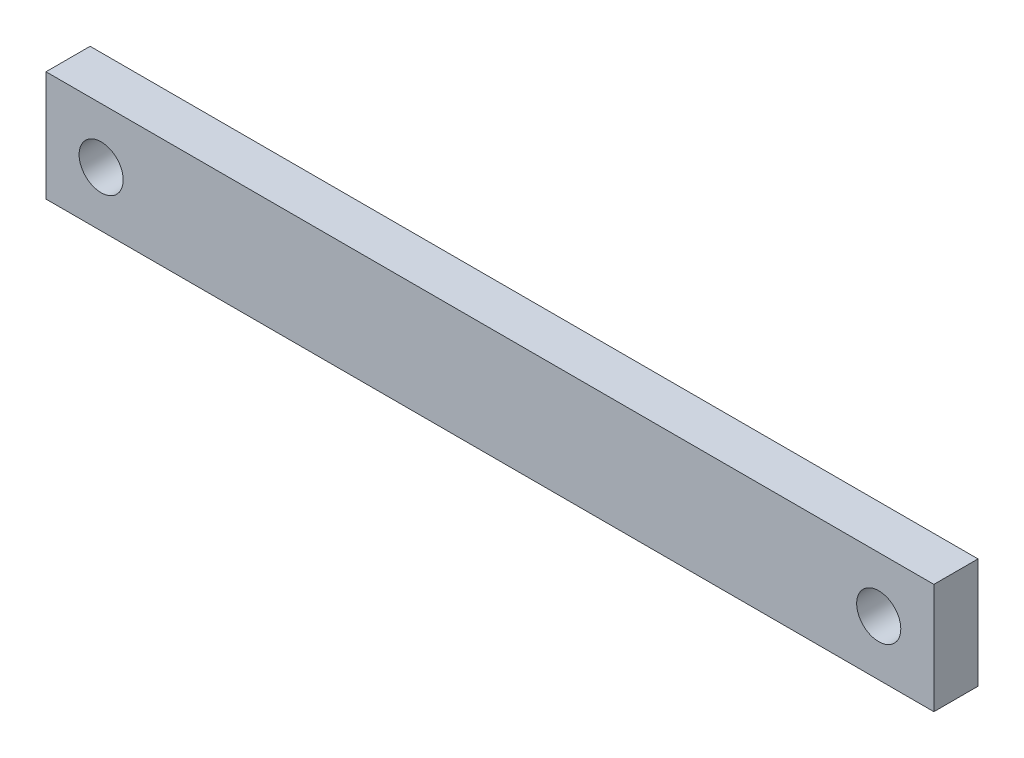
ISO-10303-21;
HEADER;
FILE_DESCRIPTION(('STEP AP214'),'2;1');
FILE_NAME('part.step','',(''),(''),'','','');
FILE_SCHEMA(('AUTOMOTIVE_DESIGN { 1 0 10303 214 1 1 1 1 }'));
ENDSEC;
DATA;
#1=APPLICATION_CONTEXT('core data for automotive mechanical design processes');
#2=APPLICATION_PROTOCOL_DEFINITION('international standard','automotive_design',2000,#1);
#3=PRODUCT_CONTEXT('',#1,'mechanical');
#4=PRODUCT('Part','Part','',(#3));
#5=PRODUCT_RELATED_PRODUCT_CATEGORY('part','',(#4));
#6=PRODUCT_DEFINITION_FORMATION('','',#4);
#7=PRODUCT_DEFINITION_CONTEXT('part definition',#1,'design');
#8=PRODUCT_DEFINITION('design','',#6,#7);
#9=PRODUCT_DEFINITION_SHAPE('','',#8);
#10=(LENGTH_UNIT() NAMED_UNIT(*) SI_UNIT(.MILLI.,.METRE.));
#11=(NAMED_UNIT(*) PLANE_ANGLE_UNIT() SI_UNIT($,.RADIAN.));
#12=(NAMED_UNIT(*) SI_UNIT($,.STERADIAN.) SOLID_ANGLE_UNIT());
#13=UNCERTAINTY_MEASURE_WITH_UNIT(LENGTH_MEASURE(1.E-05),#10,'distance_accuracy_value','');
#14=(GEOMETRIC_REPRESENTATION_CONTEXT(3) GLOBAL_UNCERTAINTY_ASSIGNED_CONTEXT((#13)) GLOBAL_UNIT_ASSIGNED_CONTEXT((#10,
#11,#12)) REPRESENTATION_CONTEXT('',''));
#15=CARTESIAN_POINT('',(0.,0.,0.));
#16=DIRECTION('',(0.,0.,1.));
#17=DIRECTION('',(1.,0.,0.));
#18=AXIS2_PLACEMENT_3D('',#15,#16,#17);
#19=CARTESIAN_POINT('',(0.,0.,8.));
#20=DIRECTION('',(0.,0.,-1.));
#21=DIRECTION('',(-1.,0.,0.));
#22=AXIS2_PLACEMENT_3D('',#19,#20,#21);
#23=PLANE('',#22);
#24=DIRECTION('',(0.,-1.,0.));
#25=VECTOR('',#24,1.);
#26=CARTESIAN_POINT('',(-80.5,9.99999999999999,8.));
#27=LINE('',#26,#25);
#28=CARTESIAN_POINT('',(-80.5,9.99999999999999,8.));
#29=VERTEX_POINT('',#28);
#30=CARTESIAN_POINT('',(-80.5,-10.,8.));
#31=VERTEX_POINT('',#30);
#32=EDGE_CURVE('E98',#29,#31,#27,.T.);
#33=ORIENTED_EDGE('',*,*,#32,.T.);
#34=DIRECTION('',(1.,0.,0.));
#35=VECTOR('',#34,1.);
#36=CARTESIAN_POINT('',(80.5,-9.99999999999999,8.));
#37=LINE('',#36,#35);
#38=CARTESIAN_POINT('',(80.5,-9.99999999999999,8.));
#39=VERTEX_POINT('',#38);
#40=EDGE_CURVE('E93',#31,#39,#37,.T.);
#41=ORIENTED_EDGE('',*,*,#40,.T.);
#42=DIRECTION('',(0.,1.,0.));
#43=VECTOR('',#42,1.);
#44=CARTESIAN_POINT('',(80.5,10.,8.));
#45=LINE('',#44,#43);
#46=CARTESIAN_POINT('',(80.5,10.,8.));
#47=VERTEX_POINT('',#46);
#48=EDGE_CURVE('E96',#39,#47,#45,.T.);
#49=ORIENTED_EDGE('',*,*,#48,.T.);
#50=DIRECTION('',(-1.,0.,0.));
#51=VECTOR('',#50,1.);
#52=CARTESIAN_POINT('',(80.5,10.,8.));
#53=LINE('',#52,#51);
#54=EDGE_CURVE('E63',#47,#29,#53,.T.);
#55=ORIENTED_EDGE('',*,*,#54,.T.);
#56=EDGE_LOOP('',(#33,#41,#49,#55));
#57=FACE_BOUND('',#56,.T.);
#58=CARTESIAN_POINT('',(-70.5,0.,8.));
#59=DIRECTION('',(0.,0.,1.));
#60=DIRECTION('',(1.,0.,0.));
#61=AXIS2_PLACEMENT_3D('',#58,#59,#60);
#62=CIRCLE('',#61,4.00000000000001);
#63=CARTESIAN_POINT('',(-66.5,0.,8.));
#64=VERTEX_POINT('',#63);
#65=EDGE_CURVE('E118',#64,#64,#62,.T.);
#66=ORIENTED_EDGE('',*,*,#65,.F.);
#67=EDGE_LOOP('',(#66));
#68=FACE_BOUND('',#67,.T.);
#69=CARTESIAN_POINT('',(70.5,0.,8.));
#70=DIRECTION('',(0.,0.,1.));
#71=DIRECTION('',(1.,0.,0.));
#72=AXIS2_PLACEMENT_3D('',#69,#70,#71);
#73=CIRCLE('',#72,4.00000000000001);
#74=CARTESIAN_POINT('',(74.5,0.,8.));
#75=VERTEX_POINT('',#74);
#76=EDGE_CURVE('E140',#75,#75,#73,.T.);
#77=ORIENTED_EDGE('',*,*,#76,.F.);
#78=EDGE_LOOP('',(#77));
#79=FACE_BOUND('',#78,.T.);
#80=ADVANCED_FACE('F45',(#57,#68,#79),#23,.F.);
#81=CARTESIAN_POINT('',(0.,0.,0.));
#82=DIRECTION('',(0.,0.,-1.));
#83=DIRECTION('',(-1.,0.,0.));
#84=AXIS2_PLACEMENT_3D('',#81,#82,#83);
#85=PLANE('',#84);
#86=CARTESIAN_POINT('',(-70.5,0.,0.));
#87=DIRECTION('',(0.,0.,1.));
#88=DIRECTION('',(1.,0.,0.));
#89=AXIS2_PLACEMENT_3D('',#86,#87,#88);
#90=CIRCLE('',#89,4.00000000000001);
#91=CARTESIAN_POINT('',(-66.5,0.,0.));
#92=VERTEX_POINT('',#91);
#93=EDGE_CURVE('E136',#92,#92,#90,.T.);
#94=ORIENTED_EDGE('',*,*,#93,.T.);
#95=EDGE_LOOP('',(#94));
#96=FACE_BOUND('',#95,.T.);
#97=DIRECTION('',(0.,-1.,0.));
#98=VECTOR('',#97,1.);
#99=CARTESIAN_POINT('',(-80.5,9.99999999999999,0.));
#100=LINE('',#99,#98);
#101=CARTESIAN_POINT('',(-80.5,9.99999999999999,0.));
#102=VERTEX_POINT('',#101);
#103=CARTESIAN_POINT('',(-80.5,-10.,0.));
#104=VERTEX_POINT('',#103);
#105=EDGE_CURVE('E114',#102,#104,#100,.T.);
#106=ORIENTED_EDGE('',*,*,#105,.F.);
#107=DIRECTION('',(-1.,0.,0.));
#108=VECTOR('',#107,1.);
#109=CARTESIAN_POINT('',(80.5,10.,0.));
#110=LINE('',#109,#108);
#111=CARTESIAN_POINT('',(80.5,10.,0.));
#112=VERTEX_POINT('',#111);
#113=EDGE_CURVE('E86',#112,#102,#110,.T.);
#114=ORIENTED_EDGE('',*,*,#113,.F.);
#115=DIRECTION('',(0.,1.,0.));
#116=VECTOR('',#115,1.);
#117=CARTESIAN_POINT('',(80.5,10.,0.));
#118=LINE('',#117,#116);
#119=CARTESIAN_POINT('',(80.5,-9.99999999999999,0.));
#120=VERTEX_POINT('',#119);
#121=EDGE_CURVE('E80',#120,#112,#118,.T.);
#122=ORIENTED_EDGE('',*,*,#121,.F.);
#123=DIRECTION('',(1.,0.,0.));
#124=VECTOR('',#123,1.);
#125=CARTESIAN_POINT('',(80.5,-9.99999999999999,0.));
#126=LINE('',#125,#124);
#127=EDGE_CURVE('E103',#104,#120,#126,.T.);
#128=ORIENTED_EDGE('',*,*,#127,.F.);
#129=EDGE_LOOP('',(#106,#114,#122,#128));
#130=FACE_BOUND('',#129,.T.);
#131=CARTESIAN_POINT('',(70.5,0.,0.));
#132=DIRECTION('',(0.,0.,1.));
#133=DIRECTION('',(1.,0.,0.));
#134=AXIS2_PLACEMENT_3D('',#131,#132,#133);
#135=CIRCLE('',#134,4.00000000000001);
#136=CARTESIAN_POINT('',(74.5,0.,0.));
#137=VERTEX_POINT('',#136);
#138=EDGE_CURVE('E144',#137,#137,#135,.T.);
#139=ORIENTED_EDGE('',*,*,#138,.T.);
#140=EDGE_LOOP('',(#139));
#141=FACE_BOUND('',#140,.T.);
#142=ADVANCED_FACE('F131',(#96,#130,#141),#85,.T.);
#143=CARTESIAN_POINT('',(-80.5,9.99999999999999,8.));
#144=DIRECTION('',(1.,0.,0.));
#145=DIRECTION('',(0.,0.,-1.));
#146=AXIS2_PLACEMENT_3D('',#143,#144,#145);
#147=PLANE('',#146);
#148=ORIENTED_EDGE('',*,*,#105,.T.);
#149=DIRECTION('',(0.,0.,-1.));
#150=VECTOR('',#149,1.);
#151=CARTESIAN_POINT('',(-80.5,-10.,8.));
#152=LINE('',#151,#150);
#153=EDGE_CURVE('E11',#31,#104,#152,.T.);
#154=ORIENTED_EDGE('',*,*,#153,.F.);
#155=ORIENTED_EDGE('',*,*,#32,.F.);
#156=DIRECTION('',(0.,0.,-1.));
#157=VECTOR('',#156,1.);
#158=CARTESIAN_POINT('',(-80.5,9.99999999999999,8.));
#159=LINE('',#158,#157);
#160=EDGE_CURVE('E110',#29,#102,#159,.T.);
#161=ORIENTED_EDGE('',*,*,#160,.T.);
#162=EDGE_LOOP('',(#148,#154,#155,#161));
#163=FACE_BOUND('',#162,.T.);
#164=ADVANCED_FACE('F47',(#163),#147,.F.);
#165=CARTESIAN_POINT('',(80.5,-9.99999999999999,8.));
#166=DIRECTION('',(0.,1.,0.));
#167=DIRECTION('',(-1.,0.,0.));
#168=AXIS2_PLACEMENT_3D('',#165,#166,#167);
#169=PLANE('',#168);
#170=ORIENTED_EDGE('',*,*,#127,.T.);
#171=DIRECTION('',(0.,0.,-1.));
#172=VECTOR('',#171,1.);
#173=CARTESIAN_POINT('',(80.5,-9.99999999999999,8.));
#174=LINE('',#173,#172);
#175=EDGE_CURVE('E55',#39,#120,#174,.T.);
#176=ORIENTED_EDGE('',*,*,#175,.F.);
#177=ORIENTED_EDGE('',*,*,#40,.F.);
#178=ORIENTED_EDGE('',*,*,#153,.T.);
#179=EDGE_LOOP('',(#170,#176,#177,#178));
#180=FACE_BOUND('',#179,.T.);
#181=ADVANCED_FACE('F102',(#180),#169,.F.);
#182=CARTESIAN_POINT('',(80.5,10.,8.));
#183=DIRECTION('',(-1.,0.,0.));
#184=DIRECTION('',(0.,0.,1.));
#185=AXIS2_PLACEMENT_3D('',#182,#183,#184);
#186=PLANE('',#185);
#187=ORIENTED_EDGE('',*,*,#121,.T.);
#188=DIRECTION('',(0.,0.,-1.));
#189=VECTOR('',#188,1.);
#190=CARTESIAN_POINT('',(80.5,10.,8.));
#191=LINE('',#190,#189);
#192=EDGE_CURVE('E105',#47,#112,#191,.T.);
#193=ORIENTED_EDGE('',*,*,#192,.F.);
#194=ORIENTED_EDGE('',*,*,#48,.F.);
#195=ORIENTED_EDGE('',*,*,#175,.T.);
#196=EDGE_LOOP('',(#187,#193,#194,#195));
#197=FACE_BOUND('',#196,.T.);
#198=ADVANCED_FACE('F106',(#197),#186,.F.);
#199=CARTESIAN_POINT('',(80.5,10.,8.));
#200=DIRECTION('',(0.,-1.,0.));
#201=DIRECTION('',(1.,0.,0.));
#202=AXIS2_PLACEMENT_3D('',#199,#200,#201);
#203=PLANE('',#202);
#204=ORIENTED_EDGE('',*,*,#113,.T.);
#205=ORIENTED_EDGE('',*,*,#160,.F.);
#206=ORIENTED_EDGE('',*,*,#54,.F.);
#207=ORIENTED_EDGE('',*,*,#192,.T.);
#208=EDGE_LOOP('',(#204,#205,#206,#207));
#209=FACE_BOUND('',#208,.T.);
#210=ADVANCED_FACE('F128',(#209),#203,.F.);
#211=CARTESIAN_POINT('',(-70.5,0.,8.));
#212=DIRECTION('',(0.,0.,-1.));
#213=DIRECTION('',(-1.,0.,0.));
#214=AXIS2_PLACEMENT_3D('',#211,#212,#213);
#215=CYLINDRICAL_SURFACE('',#214,4.00000000000001);
#216=ORIENTED_EDGE('',*,*,#65,.T.);
#217=EDGE_LOOP('',(#216));
#218=FACE_BOUND('',#217,.T.);
#219=ORIENTED_EDGE('',*,*,#93,.F.);
#220=EDGE_LOOP('',(#219));
#221=FACE_BOUND('',#220,.T.);
#222=ADVANCED_FACE('F163',(#218,#221),#215,.F.);
#223=CARTESIAN_POINT('',(70.5,0.,8.));
#224=DIRECTION('',(0.,0.,-1.));
#225=DIRECTION('',(-1.,0.,0.));
#226=AXIS2_PLACEMENT_3D('',#223,#224,#225);
#227=CYLINDRICAL_SURFACE('',#226,4.00000000000001);
#228=ORIENTED_EDGE('',*,*,#76,.T.);
#229=EDGE_LOOP('',(#228));
#230=FACE_BOUND('',#229,.T.);
#231=ORIENTED_EDGE('',*,*,#138,.F.);
#232=EDGE_LOOP('',(#231));
#233=FACE_BOUND('',#232,.T.);
#234=ADVANCED_FACE('F152',(#230,#233),#227,.F.);
#235=CLOSED_SHELL('',(#80,#142,#164,#181,#198,#210,#222,#234));
#236=MANIFOLD_SOLID_BREP('B2',#235);
#237=ADVANCED_BREP_SHAPE_REPRESENTATION('',(#18,#236),#14);
#238=SHAPE_DEFINITION_REPRESENTATION(#9,#237);
ENDSEC;
END-ISO-10303-21;
